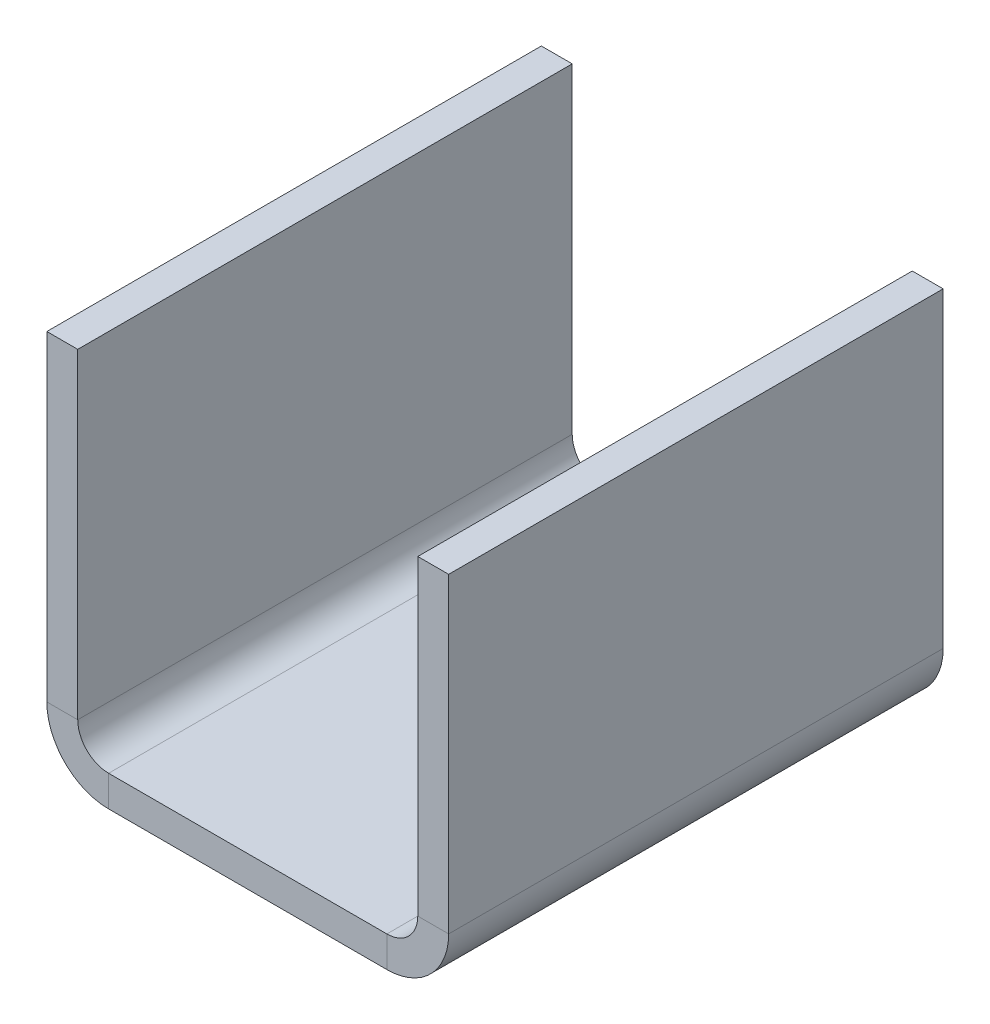
ISO-10303-21;
HEADER;
FILE_DESCRIPTION(('STEP AP214'),'2;1');
FILE_NAME('part.step','',(''),(''),'','','');
FILE_SCHEMA(('AUTOMOTIVE_DESIGN { 1 0 10303 214 1 1 1 1 }'));
ENDSEC;
DATA;
#1=APPLICATION_CONTEXT('core data for automotive mechanical design processes');
#2=APPLICATION_PROTOCOL_DEFINITION('international standard','automotive_design',2000,#1);
#3=PRODUCT_CONTEXT('',#1,'mechanical');
#4=PRODUCT('Part','Part','',(#3));
#5=PRODUCT_RELATED_PRODUCT_CATEGORY('part','',(#4));
#6=PRODUCT_DEFINITION_FORMATION('','',#4);
#7=PRODUCT_DEFINITION_CONTEXT('part definition',#1,'design');
#8=PRODUCT_DEFINITION('design','',#6,#7);
#9=PRODUCT_DEFINITION_SHAPE('','',#8);
#10=(LENGTH_UNIT() NAMED_UNIT(*) SI_UNIT(.MILLI.,.METRE.));
#11=(NAMED_UNIT(*) PLANE_ANGLE_UNIT() SI_UNIT($,.RADIAN.));
#12=(NAMED_UNIT(*) SI_UNIT($,.STERADIAN.) SOLID_ANGLE_UNIT());
#13=UNCERTAINTY_MEASURE_WITH_UNIT(LENGTH_MEASURE(1.E-05),#10,'distance_accuracy_value','');
#14=(GEOMETRIC_REPRESENTATION_CONTEXT(3) GLOBAL_UNCERTAINTY_ASSIGNED_CONTEXT((#13)) GLOBAL_UNIT_ASSIGNED_CONTEXT((#10,
#11,#12)) REPRESENTATION_CONTEXT('',''));
#15=CARTESIAN_POINT('',(0.,0.,0.));
#16=DIRECTION('',(0.,0.,1.));
#17=DIRECTION('',(1.,0.,0.));
#18=AXIS2_PLACEMENT_3D('',#15,#16,#17);
#19=CARTESIAN_POINT('',(-9.26353669583813,-2.032,0.));
#20=DIRECTION('',(0.,0.,1.));
#21=DIRECTION('',(1.,0.,0.));
#22=AXIS2_PLACEMENT_3D('',#19,#20,#21);
#23=PLANE('',#22);
#24=DIRECTION('',(0.,-1.,0.));
#25=VECTOR('',#24,1.);
#26=CARTESIAN_POINT('',(-35.4631305409845,-2.032,0.));
#27=LINE('',#26,#25);
#28=CARTESIAN_POINT('',(-35.4631305409845,0.348000065999996,0.));
#29=VERTEX_POINT('',#28);
#30=CARTESIAN_POINT('',(-35.4631305409845,-2.032,0.));
#31=VERTEX_POINT('',#30);
#32=EDGE_CURVE('E11',#29,#31,#27,.T.);
#33=ORIENTED_EDGE('',*,*,#32,.F.);
#34=DIRECTION('',(-1.,0.,0.));
#35=VECTOR('',#34,1.);
#36=CARTESIAN_POINT('',(-9.26353669583813,0.348000066,0.));
#37=LINE('',#36,#35);
#38=CARTESIAN_POINT('',(-14.0235368278381,0.348000066,0.));
#39=VERTEX_POINT('',#38);
#40=EDGE_CURVE('E98',#29,#39,#37,.F.);
#41=ORIENTED_EDGE('',*,*,#40,.T.);
#42=DIRECTION('',(0.,-1.,0.));
#43=VECTOR('',#42,1.);
#44=CARTESIAN_POINT('',(-14.0235368278381,-2.032,0.));
#45=LINE('',#44,#43);
#46=CARTESIAN_POINT('',(-14.0235368278381,-2.032,0.));
#47=VERTEX_POINT('',#46);
#48=EDGE_CURVE('E51',#39,#47,#45,.T.);
#49=ORIENTED_EDGE('',*,*,#48,.T.);
#50=DIRECTION('',(1.,0.,0.));
#51=VECTOR('',#50,1.);
#52=CARTESIAN_POINT('',(-9.26353669583813,-2.032,0.));
#53=LINE('',#52,#51);
#54=EDGE_CURVE('E100',#31,#47,#53,.T.);
#55=ORIENTED_EDGE('',*,*,#54,.F.);
#56=EDGE_LOOP('',(#33,#41,#49,#55));
#57=FACE_BOUND('',#56,.T.);
#58=ADVANCED_FACE('F41',(#57),#23,.F.);
#59=CARTESIAN_POINT('',(-14.0235368278381,2.728000132,0.));
#60=DIRECTION('',(0.,0.,1.));
#61=DIRECTION('',(1.,0.,0.));
#62=AXIS2_PLACEMENT_3D('',#59,#60,#61);
#63=PLANE('',#62);
#64=ORIENTED_EDGE('',*,*,#48,.F.);
#65=CARTESIAN_POINT('',(-14.0235368278381,2.728000132,0.));
#66=DIRECTION('',(0.,0.,-1.));
#67=DIRECTION('',(-1.,0.,0.));
#68=AXIS2_PLACEMENT_3D('',#65,#66,#67);
#69=CIRCLE('',#68,2.380000066);
#70=CARTESIAN_POINT('',(-11.6435367618381,2.728000132,0.));
#71=VERTEX_POINT('',#70);
#72=EDGE_CURVE('E139',#39,#71,#69,.F.);
#73=ORIENTED_EDGE('',*,*,#72,.T.);
#74=DIRECTION('',(1.,0.,0.));
#75=VECTOR('',#74,1.);
#76=CARTESIAN_POINT('',(-9.26353669583813,2.72800013200001,0.));
#77=LINE('',#76,#75);
#78=CARTESIAN_POINT('',(-9.26353669583813,2.72800013200001,0.));
#79=VERTEX_POINT('',#78);
#80=EDGE_CURVE('E166',#71,#79,#77,.T.);
#81=ORIENTED_EDGE('',*,*,#80,.T.);
#82=CARTESIAN_POINT('',(-14.0235368278381,2.728000132,0.));
#83=DIRECTION('',(0.,0.,-1.));
#84=DIRECTION('',(-1.,0.,0.));
#85=AXIS2_PLACEMENT_3D('',#82,#83,#84);
#86=CIRCLE('',#85,4.760000132);
#87=EDGE_CURVE('E175',#47,#79,#86,.F.);
#88=ORIENTED_EDGE('',*,*,#87,.F.);
#89=EDGE_LOOP('',(#64,#73,#81,#88));
#90=FACE_BOUND('',#89,.T.);
#91=ADVANCED_FACE('F174',(#90),#63,.F.);
#92=CARTESIAN_POINT('',(-9.26353669583813,26.7235868169829,0.));
#93=DIRECTION('',(0.,0.,1.));
#94=DIRECTION('',(0.,1.,0.));
#95=AXIS2_PLACEMENT_3D('',#92,#93,#94);
#96=PLANE('',#95);
#97=ORIENTED_EDGE('',*,*,#80,.F.);
#98=DIRECTION('',(0.,-1.,0.));
#99=VECTOR('',#98,1.);
#100=CARTESIAN_POINT('',(-11.6435367618381,26.7235868169829,0.));
#101=LINE('',#100,#99);
#102=CARTESIAN_POINT('',(-11.6435367618381,26.7235868169829,0.));
#103=VERTEX_POINT('',#102);
#104=EDGE_CURVE('E136',#71,#103,#101,.F.);
#105=ORIENTED_EDGE('',*,*,#104,.T.);
#106=DIRECTION('',(1.,0.,0.));
#107=VECTOR('',#106,1.);
#108=CARTESIAN_POINT('',(-9.26353669583813,26.7235868169829,0.));
#109=LINE('',#108,#107);
#110=CARTESIAN_POINT('',(-9.26353669583813,26.7235868169829,0.));
#111=VERTEX_POINT('',#110);
#112=EDGE_CURVE('E163',#103,#111,#109,.T.);
#113=ORIENTED_EDGE('',*,*,#112,.T.);
#114=DIRECTION('',(0.,1.,0.));
#115=VECTOR('',#114,1.);
#116=CARTESIAN_POINT('',(-9.26353669583813,26.7235868169829,0.));
#117=LINE('',#116,#115);
#118=EDGE_CURVE('E194',#79,#111,#117,.T.);
#119=ORIENTED_EDGE('',*,*,#118,.F.);
#120=EDGE_LOOP('',(#97,#105,#113,#119));
#121=FACE_BOUND('',#120,.T.);
#122=ADVANCED_FACE('F195',(#121),#96,.F.);
#123=CARTESIAN_POINT('',(-9.26353669583813,26.7235868169829,38.1));
#124=DIRECTION('',(0.,1.,0.));
#125=DIRECTION('',(0.,0.,-1.));
#126=AXIS2_PLACEMENT_3D('',#123,#124,#125);
#127=PLANE('',#126);
#128=ORIENTED_EDGE('',*,*,#112,.F.);
#129=DIRECTION('',(0.,0.,1.));
#130=VECTOR('',#129,1.);
#131=CARTESIAN_POINT('',(-11.6435367618381,26.7235868169829,38.1));
#132=LINE('',#131,#130);
#133=CARTESIAN_POINT('',(-11.6435367618381,26.7235868169829,38.1));
#134=VERTEX_POINT('',#133);
#135=EDGE_CURVE('E232',#134,#103,#132,.F.);
#136=ORIENTED_EDGE('',*,*,#135,.F.);
#137=DIRECTION('',(1.,0.,0.));
#138=VECTOR('',#137,1.);
#139=CARTESIAN_POINT('',(-9.26353669583813,26.7235868169829,38.1));
#140=LINE('',#139,#138);
#141=CARTESIAN_POINT('',(-9.26353669583813,26.7235868169829,38.1));
#142=VERTEX_POINT('',#141);
#143=EDGE_CURVE('E160',#134,#142,#140,.T.);
#144=ORIENTED_EDGE('',*,*,#143,.T.);
#145=DIRECTION('',(0.,0.,-1.));
#146=VECTOR('',#145,1.);
#147=CARTESIAN_POINT('',(-9.26353669583813,26.7235868169829,38.1));
#148=LINE('',#147,#146);
#149=EDGE_CURVE('E199',#142,#111,#148,.T.);
#150=ORIENTED_EDGE('',*,*,#149,.T.);
#151=EDGE_LOOP('',(#128,#136,#144,#150));
#152=FACE_BOUND('',#151,.T.);
#153=ADVANCED_FACE('F243',(#152),#127,.T.);
#154=CARTESIAN_POINT('',(-9.26353669583813,26.7235868169829,38.1));
#155=DIRECTION('',(0.,0.,1.));
#156=DIRECTION('',(0.,1.,0.));
#157=AXIS2_PLACEMENT_3D('',#154,#155,#156);
#158=PLANE('',#157);
#159=ORIENTED_EDGE('',*,*,#143,.F.);
#160=DIRECTION('',(0.,-1.,0.));
#161=VECTOR('',#160,1.);
#162=CARTESIAN_POINT('',(-11.6435367618381,26.7235868169829,38.1));
#163=LINE('',#162,#161);
#164=CARTESIAN_POINT('',(-11.6435367618381,2.72800013200001,38.1));
#165=VERTEX_POINT('',#164);
#166=EDGE_CURVE('E129',#165,#134,#163,.F.);
#167=ORIENTED_EDGE('',*,*,#166,.F.);
#168=DIRECTION('',(1.,0.,0.));
#169=VECTOR('',#168,1.);
#170=CARTESIAN_POINT('',(-9.26353669583813,2.72800013200001,38.1));
#171=LINE('',#170,#169);
#172=CARTESIAN_POINT('',(-9.26353669583813,2.72800013200001,38.1));
#173=VERTEX_POINT('',#172);
#174=EDGE_CURVE('E157',#165,#173,#171,.T.);
#175=ORIENTED_EDGE('',*,*,#174,.T.);
#176=DIRECTION('',(0.,1.,0.));
#177=VECTOR('',#176,1.);
#178=CARTESIAN_POINT('',(-9.26353669583813,26.7235868169829,38.1));
#179=LINE('',#178,#177);
#180=EDGE_CURVE('E205',#173,#142,#179,.T.);
#181=ORIENTED_EDGE('',*,*,#180,.T.);
#182=EDGE_LOOP('',(#159,#167,#175,#181));
#183=FACE_BOUND('',#182,.T.);
#184=ADVANCED_FACE('F293',(#183),#158,.T.);
#185=CARTESIAN_POINT('',(-14.0235368278381,2.728000132,38.1));
#186=DIRECTION('',(0.,0.,-1.));
#187=DIRECTION('',(-1.,0.,0.));
#188=AXIS2_PLACEMENT_3D('',#185,#186,#187);
#189=PLANE('',#188);
#190=ORIENTED_EDGE('',*,*,#174,.F.);
#191=CARTESIAN_POINT('',(-14.0235368278381,2.728000132,38.1));
#192=DIRECTION('',(0.,0.,-1.));
#193=DIRECTION('',(-1.,0.,0.));
#194=AXIS2_PLACEMENT_3D('',#191,#192,#193);
#195=CIRCLE('',#194,2.380000066);
#196=CARTESIAN_POINT('',(-14.0235368278381,0.348000065999999,38.1));
#197=VERTEX_POINT('',#196);
#198=EDGE_CURVE('E134',#165,#197,#195,.T.);
#199=ORIENTED_EDGE('',*,*,#198,.T.);
#200=DIRECTION('',(0.,-1.,0.));
#201=VECTOR('',#200,1.);
#202=CARTESIAN_POINT('',(-14.0235368278381,-2.032,38.1));
#203=LINE('',#202,#201);
#204=CARTESIAN_POINT('',(-14.0235368278381,-2.032,38.1));
#205=VERTEX_POINT('',#204);
#206=EDGE_CURVE('E155',#197,#205,#203,.T.);
#207=ORIENTED_EDGE('',*,*,#206,.T.);
#208=CARTESIAN_POINT('',(-14.0235368278381,2.728000132,38.1));
#209=DIRECTION('',(0.,0.,1.));
#210=DIRECTION('',(1.,0.,0.));
#211=AXIS2_PLACEMENT_3D('',#208,#209,#210);
#212=CIRCLE('',#211,4.760000132);
#213=EDGE_CURVE('E191',#173,#205,#212,.F.);
#214=ORIENTED_EDGE('',*,*,#213,.F.);
#215=EDGE_LOOP('',(#190,#199,#207,#214));
#216=FACE_BOUND('',#215,.T.);
#217=ADVANCED_FACE('F295',(#216),#189,.F.);
#218=CARTESIAN_POINT('',(-9.26353669583813,-2.032,38.1));
#219=DIRECTION('',(0.,0.,1.));
#220=DIRECTION('',(1.,0.,0.));
#221=AXIS2_PLACEMENT_3D('',#218,#219,#220);
#222=PLANE('',#221);
#223=ORIENTED_EDGE('',*,*,#206,.F.);
#224=DIRECTION('',(-1.,0.,0.));
#225=VECTOR('',#224,1.);
#226=CARTESIAN_POINT('',(-9.26353669583813,0.348000066,38.1));
#227=LINE('',#226,#225);
#228=CARTESIAN_POINT('',(-35.4631305409845,0.348000065999996,38.1));
#229=VERTEX_POINT('',#228);
#230=EDGE_CURVE('E128',#229,#197,#227,.F.);
#231=ORIENTED_EDGE('',*,*,#230,.F.);
#232=DIRECTION('',(0.,-1.,0.));
#233=VECTOR('',#232,1.);
#234=CARTESIAN_POINT('',(-35.4631305409845,-2.032,38.1));
#235=LINE('',#234,#233);
#236=CARTESIAN_POINT('',(-35.4631305409845,-2.032,38.1));
#237=VERTEX_POINT('',#236);
#238=EDGE_CURVE('E152',#229,#237,#235,.T.);
#239=ORIENTED_EDGE('',*,*,#238,.T.);
#240=DIRECTION('',(1.,0.,0.));
#241=VECTOR('',#240,1.);
#242=CARTESIAN_POINT('',(-9.26353669583813,-2.032,38.1));
#243=LINE('',#242,#241);
#244=EDGE_CURVE('E250',#237,#205,#243,.T.);
#245=ORIENTED_EDGE('',*,*,#244,.T.);
#246=EDGE_LOOP('',(#223,#231,#239,#245));
#247=FACE_BOUND('',#246,.T.);
#248=ADVANCED_FACE('F298',(#247),#222,.T.);
#249=CARTESIAN_POINT('',(-35.4631305409845,2.728000132,38.1));
#250=DIRECTION('',(0.,0.,-1.));
#251=DIRECTION('',(-1.,0.,0.));
#252=AXIS2_PLACEMENT_3D('',#249,#250,#251);
#253=PLANE('',#252);
#254=ORIENTED_EDGE('',*,*,#238,.F.);
#255=CARTESIAN_POINT('',(-35.4631305409845,2.728000132,38.1));
#256=DIRECTION('',(0.,0.,-1.));
#257=DIRECTION('',(-1.,0.,0.));
#258=AXIS2_PLACEMENT_3D('',#255,#256,#257);
#259=CIRCLE('',#258,2.380000066);
#260=CARTESIAN_POINT('',(-37.8431306069845,2.728000132,38.1));
#261=VERTEX_POINT('',#260);
#262=EDGE_CURVE('E116',#229,#261,#259,.T.);
#263=ORIENTED_EDGE('',*,*,#262,.T.);
#264=DIRECTION('',(-1.,0.,0.));
#265=VECTOR('',#264,1.);
#266=CARTESIAN_POINT('',(-40.2231306729845,2.728000132,38.1));
#267=LINE('',#266,#265);
#268=CARTESIAN_POINT('',(-40.2231306729845,2.728000132,38.1));
#269=VERTEX_POINT('',#268);
#270=EDGE_CURVE('E149',#261,#269,#267,.T.);
#271=ORIENTED_EDGE('',*,*,#270,.T.);
#272=CARTESIAN_POINT('',(-35.4631305409845,2.728000132,38.1));
#273=DIRECTION('',(0.,0.,1.));
#274=DIRECTION('',(1.,0.,0.));
#275=AXIS2_PLACEMENT_3D('',#272,#273,#274);
#276=CIRCLE('',#275,4.760000132);
#277=EDGE_CURVE('E200',#237,#269,#276,.F.);
#278=ORIENTED_EDGE('',*,*,#277,.F.);
#279=EDGE_LOOP('',(#254,#263,#271,#278));
#280=FACE_BOUND('',#279,.T.);
#281=ADVANCED_FACE('F325',(#280),#253,.F.);
#282=CARTESIAN_POINT('',(-40.2231306729845,-2.032,38.1));
#283=DIRECTION('',(0.,0.,1.));
#284=DIRECTION('',(0.,-1.,0.));
#285=AXIS2_PLACEMENT_3D('',#282,#283,#284);
#286=PLANE('',#285);
#287=ORIENTED_EDGE('',*,*,#270,.F.);
#288=DIRECTION('',(0.,1.,0.));
#289=VECTOR('',#288,1.);
#290=CARTESIAN_POINT('',(-37.8431306069845,-2.032,38.1));
#291=LINE('',#290,#289);
#292=CARTESIAN_POINT('',(-37.8431306069845,27.4465957671873,38.1));
#293=VERTEX_POINT('',#292);
#294=EDGE_CURVE('E224',#293,#261,#291,.F.);
#295=ORIENTED_EDGE('',*,*,#294,.F.);
#296=DIRECTION('',(-1.,0.,0.));
#297=VECTOR('',#296,1.);
#298=CARTESIAN_POINT('',(-40.2231306729845,27.4465957671873,38.1));
#299=LINE('',#298,#297);
#300=CARTESIAN_POINT('',(-40.2231306729845,27.4465957671873,38.1));
#301=VERTEX_POINT('',#300);
#302=EDGE_CURVE('E146',#293,#301,#299,.T.);
#303=ORIENTED_EDGE('',*,*,#302,.T.);
#304=DIRECTION('',(0.,-1.,0.));
#305=VECTOR('',#304,1.);
#306=CARTESIAN_POINT('',(-40.2231306729845,-2.032,38.1));
#307=LINE('',#306,#305);
#308=EDGE_CURVE('E256',#301,#269,#307,.T.);
#309=ORIENTED_EDGE('',*,*,#308,.T.);
#310=EDGE_LOOP('',(#287,#295,#303,#309));
#311=FACE_BOUND('',#310,.T.);
#312=ADVANCED_FACE('F274',(#311),#286,.T.);
#313=CARTESIAN_POINT('',(-40.2231306729845,27.4465957671873,38.1));
#314=DIRECTION('',(0.,-1.,0.));
#315=DIRECTION('',(0.,0.,-1.));
#316=AXIS2_PLACEMENT_3D('',#313,#314,#315);
#317=PLANE('',#316);
#318=ORIENTED_EDGE('',*,*,#302,.F.);
#319=DIRECTION('',(0.,0.,-1.));
#320=VECTOR('',#319,1.);
#321=CARTESIAN_POINT('',(-37.8431306069845,27.4465957671873,38.1));
#322=LINE('',#321,#320);
#323=CARTESIAN_POINT('',(-37.8431306069845,27.4465957671873,0.));
#324=VERTEX_POINT('',#323);
#325=EDGE_CURVE('E121',#293,#324,#322,.T.);
#326=ORIENTED_EDGE('',*,*,#325,.T.);
#327=DIRECTION('',(-1.,0.,0.));
#328=VECTOR('',#327,1.);
#329=CARTESIAN_POINT('',(-40.2231306729845,27.4465957671873,0.));
#330=LINE('',#329,#328);
#331=CARTESIAN_POINT('',(-40.2231306729845,27.4465957671873,0.));
#332=VERTEX_POINT('',#331);
#333=EDGE_CURVE('E143',#324,#332,#330,.T.);
#334=ORIENTED_EDGE('',*,*,#333,.T.);
#335=DIRECTION('',(0.,0.,-1.));
#336=VECTOR('',#335,1.);
#337=CARTESIAN_POINT('',(-40.2231306729845,27.4465957671873,38.1));
#338=LINE('',#337,#336);
#339=EDGE_CURVE('E259',#301,#332,#338,.T.);
#340=ORIENTED_EDGE('',*,*,#339,.F.);
#341=EDGE_LOOP('',(#318,#326,#334,#340));
#342=FACE_BOUND('',#341,.T.);
#343=ADVANCED_FACE('F330',(#342),#317,.F.);
#344=CARTESIAN_POINT('',(-40.2231306729845,-2.032,0.));
#345=DIRECTION('',(0.,0.,1.));
#346=DIRECTION('',(0.,-1.,0.));
#347=AXIS2_PLACEMENT_3D('',#344,#345,#346);
#348=PLANE('',#347);
#349=ORIENTED_EDGE('',*,*,#333,.F.);
#350=DIRECTION('',(0.,1.,0.));
#351=VECTOR('',#350,1.);
#352=CARTESIAN_POINT('',(-37.8431306069845,-2.032,0.));
#353=LINE('',#352,#351);
#354=CARTESIAN_POINT('',(-37.8431306069845,2.72800013199999,0.));
#355=VERTEX_POINT('',#354);
#356=EDGE_CURVE('E222',#324,#355,#353,.F.);
#357=ORIENTED_EDGE('',*,*,#356,.T.);
#358=DIRECTION('',(-1.,0.,0.));
#359=VECTOR('',#358,1.);
#360=CARTESIAN_POINT('',(-40.2231306729845,2.728000132,0.));
#361=LINE('',#360,#359);
#362=CARTESIAN_POINT('',(-40.2231306729845,2.728000132,0.));
#363=VERTEX_POINT('',#362);
#364=EDGE_CURVE('E45',#355,#363,#361,.T.);
#365=ORIENTED_EDGE('',*,*,#364,.T.);
#366=DIRECTION('',(0.,-1.,0.));
#367=VECTOR('',#366,1.);
#368=CARTESIAN_POINT('',(-40.2231306729845,-2.032,0.));
#369=LINE('',#368,#367);
#370=EDGE_CURVE('E253',#332,#363,#369,.T.);
#371=ORIENTED_EDGE('',*,*,#370,.F.);
#372=EDGE_LOOP('',(#349,#357,#365,#371));
#373=FACE_BOUND('',#372,.T.);
#374=ADVANCED_FACE('F284',(#373),#348,.F.);
#375=CARTESIAN_POINT('',(-35.4631305409845,2.728000132,0.));
#376=DIRECTION('',(0.,0.,1.));
#377=DIRECTION('',(1.,0.,0.));
#378=AXIS2_PLACEMENT_3D('',#375,#376,#377);
#379=PLANE('',#378);
#380=CARTESIAN_POINT('',(-35.4631305409845,2.728000132,0.));
#381=DIRECTION('',(0.,0.,-1.));
#382=DIRECTION('',(-1.,0.,0.));
#383=AXIS2_PLACEMENT_3D('',#380,#381,#382);
#384=CIRCLE('',#383,2.380000066);
#385=EDGE_CURVE('E113',#355,#29,#384,.F.);
#386=ORIENTED_EDGE('',*,*,#385,.T.);
#387=ORIENTED_EDGE('',*,*,#32,.T.);
#388=CARTESIAN_POINT('',(-35.4631305409845,2.728000132,0.));
#389=DIRECTION('',(0.,0.,-1.));
#390=DIRECTION('',(-1.,0.,0.));
#391=AXIS2_PLACEMENT_3D('',#388,#389,#390);
#392=CIRCLE('',#391,4.760000132);
#393=EDGE_CURVE('E217',#363,#31,#392,.F.);
#394=ORIENTED_EDGE('',*,*,#393,.F.);
#395=ORIENTED_EDGE('',*,*,#364,.F.);
#396=EDGE_LOOP('',(#386,#387,#394,#395));
#397=FACE_BOUND('',#396,.T.);
#398=ADVANCED_FACE('F43',(#397),#379,.F.);
#399=CARTESIAN_POINT('',(-40.2231306729845,-2.032,38.1));
#400=DIRECTION('',(1.,0.,0.));
#401=DIRECTION('',(0.,0.,-1.));
#402=AXIS2_PLACEMENT_3D('',#399,#400,#401);
#403=PLANE('',#402);
#404=ORIENTED_EDGE('',*,*,#370,.T.);
#405=DIRECTION('',(0.,0.,-1.));
#406=VECTOR('',#405,1.);
#407=CARTESIAN_POINT('',(-40.2231306729845,2.728000132,38.1));
#408=LINE('',#407,#406);
#409=EDGE_CURVE('E207',#363,#269,#408,.F.);
#410=ORIENTED_EDGE('',*,*,#409,.T.);
#411=ORIENTED_EDGE('',*,*,#308,.F.);
#412=ORIENTED_EDGE('',*,*,#339,.T.);
#413=EDGE_LOOP('',(#404,#410,#411,#412));
#414=FACE_BOUND('',#413,.T.);
#415=ADVANCED_FACE('F279',(#414),#403,.F.);
#416=CARTESIAN_POINT('',(-9.26353669583813,-2.032,38.1));
#417=DIRECTION('',(0.,1.,0.));
#418=DIRECTION('',(-1.,0.,0.));
#419=AXIS2_PLACEMENT_3D('',#416,#417,#418);
#420=PLANE('',#419);
#421=ORIENTED_EDGE('',*,*,#54,.T.);
#422=DIRECTION('',(0.,0.,-1.));
#423=VECTOR('',#422,1.);
#424=CARTESIAN_POINT('',(-14.0235368278381,-2.032,38.1));
#425=LINE('',#424,#423);
#426=EDGE_CURVE('E190',#47,#205,#425,.F.);
#427=ORIENTED_EDGE('',*,*,#426,.T.);
#428=ORIENTED_EDGE('',*,*,#244,.F.);
#429=DIRECTION('',(0.,0.,-1.));
#430=VECTOR('',#429,1.);
#431=CARTESIAN_POINT('',(-35.4631305409845,-2.032,38.1));
#432=LINE('',#431,#430);
#433=EDGE_CURVE('E211',#237,#31,#432,.T.);
#434=ORIENTED_EDGE('',*,*,#433,.T.);
#435=EDGE_LOOP('',(#421,#427,#428,#434));
#436=FACE_BOUND('',#435,.T.);
#437=ADVANCED_FACE('F300',(#436),#420,.F.);
#438=CARTESIAN_POINT('',(-9.26353669583813,26.7235868169829,38.1));
#439=DIRECTION('',(-1.,0.,0.));
#440=DIRECTION('',(0.,-1.,0.));
#441=AXIS2_PLACEMENT_3D('',#438,#439,#440);
#442=PLANE('',#441);
#443=ORIENTED_EDGE('',*,*,#180,.F.);
#444=DIRECTION('',(0.,0.,-1.));
#445=VECTOR('',#444,1.);
#446=CARTESIAN_POINT('',(-9.26353669583813,2.728000132,38.1));
#447=LINE('',#446,#445);
#448=EDGE_CURVE('E188',#173,#79,#447,.T.);
#449=ORIENTED_EDGE('',*,*,#448,.T.);
#450=ORIENTED_EDGE('',*,*,#118,.T.);
#451=ORIENTED_EDGE('',*,*,#149,.F.);
#452=EDGE_LOOP('',(#443,#449,#450,#451));
#453=FACE_BOUND('',#452,.T.);
#454=ADVANCED_FACE('F203',(#453),#442,.F.);
#455=CARTESIAN_POINT('',(-35.4631305409845,2.728000132,38.1));
#456=DIRECTION('',(0.,0.,-1.));
#457=DIRECTION('',(-1.,0.,0.));
#458=AXIS2_PLACEMENT_3D('',#455,#456,#457);
#459=CYLINDRICAL_SURFACE('',#458,4.760000132);
#460=ORIENTED_EDGE('',*,*,#277,.T.);
#461=ORIENTED_EDGE('',*,*,#409,.F.);
#462=ORIENTED_EDGE('',*,*,#393,.T.);
#463=ORIENTED_EDGE('',*,*,#433,.F.);
#464=EDGE_LOOP('',(#460,#461,#462,#463));
#465=FACE_BOUND('',#464,.T.);
#466=ADVANCED_FACE('F267',(#465),#459,.T.);
#467=CARTESIAN_POINT('',(-14.0235368278381,2.728000132,38.1));
#468=DIRECTION('',(0.,0.,-1.));
#469=DIRECTION('',(-1.,0.,0.));
#470=AXIS2_PLACEMENT_3D('',#467,#468,#469);
#471=CYLINDRICAL_SURFACE('',#470,4.760000132);
#472=ORIENTED_EDGE('',*,*,#213,.T.);
#473=ORIENTED_EDGE('',*,*,#426,.F.);
#474=ORIENTED_EDGE('',*,*,#87,.T.);
#475=ORIENTED_EDGE('',*,*,#448,.F.);
#476=EDGE_LOOP('',(#472,#473,#474,#475));
#477=FACE_BOUND('',#476,.T.);
#478=ADVANCED_FACE('F186',(#477),#471,.T.);
#479=CARTESIAN_POINT('',(-37.8431306069845,-2.032,38.1));
#480=DIRECTION('',(1.,0.,0.));
#481=DIRECTION('',(0.,0.,-1.));
#482=AXIS2_PLACEMENT_3D('',#479,#480,#481);
#483=PLANE('',#482);
#484=ORIENTED_EDGE('',*,*,#356,.F.);
#485=ORIENTED_EDGE('',*,*,#325,.F.);
#486=ORIENTED_EDGE('',*,*,#294,.T.);
#487=DIRECTION('',(0.,0.,-1.));
#488=VECTOR('',#487,1.);
#489=CARTESIAN_POINT('',(-37.8431306069845,2.72800013199999,38.1));
#490=LINE('',#489,#488);
#491=EDGE_CURVE('E120',#355,#261,#490,.F.);
#492=ORIENTED_EDGE('',*,*,#491,.F.);
#493=EDGE_LOOP('',(#484,#485,#486,#492));
#494=FACE_BOUND('',#493,.T.);
#495=ADVANCED_FACE('F345',(#494),#483,.T.);
#496=CARTESIAN_POINT('',(-9.26353669583813,0.348000066,38.1));
#497=DIRECTION('',(0.,1.,0.));
#498=DIRECTION('',(-1.,0.,0.));
#499=AXIS2_PLACEMENT_3D('',#496,#497,#498);
#500=PLANE('',#499);
#501=ORIENTED_EDGE('',*,*,#40,.F.);
#502=DIRECTION('',(0.,0.,1.));
#503=VECTOR('',#502,1.);
#504=CARTESIAN_POINT('',(-35.4631305409845,0.348000065999996,38.1));
#505=LINE('',#504,#503);
#506=EDGE_CURVE('E110',#229,#29,#505,.F.);
#507=ORIENTED_EDGE('',*,*,#506,.F.);
#508=ORIENTED_EDGE('',*,*,#230,.T.);
#509=DIRECTION('',(0.,0.,1.));
#510=VECTOR('',#509,1.);
#511=CARTESIAN_POINT('',(-14.0235368278381,0.348000066,38.1));
#512=LINE('',#511,#510);
#513=EDGE_CURVE('E126',#39,#197,#512,.T.);
#514=ORIENTED_EDGE('',*,*,#513,.F.);
#515=EDGE_LOOP('',(#501,#507,#508,#514));
#516=FACE_BOUND('',#515,.T.);
#517=ADVANCED_FACE('F124',(#516),#500,.T.);
#518=CARTESIAN_POINT('',(-11.6435367618381,26.7235868169829,38.1));
#519=DIRECTION('',(-1.,0.,0.));
#520=DIRECTION('',(0.,-1.,0.));
#521=AXIS2_PLACEMENT_3D('',#518,#519,#520);
#522=PLANE('',#521);
#523=ORIENTED_EDGE('',*,*,#166,.T.);
#524=ORIENTED_EDGE('',*,*,#135,.T.);
#525=ORIENTED_EDGE('',*,*,#104,.F.);
#526=DIRECTION('',(0.,0.,1.));
#527=VECTOR('',#526,1.);
#528=CARTESIAN_POINT('',(-11.6435367618381,2.72800013200001,38.1));
#529=LINE('',#528,#527);
#530=EDGE_CURVE('E218',#165,#71,#529,.F.);
#531=ORIENTED_EDGE('',*,*,#530,.F.);
#532=EDGE_LOOP('',(#523,#524,#525,#531));
#533=FACE_BOUND('',#532,.T.);
#534=ADVANCED_FACE('F238',(#533),#522,.T.);
#535=CARTESIAN_POINT('',(-35.4631305409845,2.728000132,38.1));
#536=DIRECTION('',(0.,0.,-1.));
#537=DIRECTION('',(-1.,0.,0.));
#538=AXIS2_PLACEMENT_3D('',#535,#536,#537);
#539=CYLINDRICAL_SURFACE('',#538,2.380000066);
#540=ORIENTED_EDGE('',*,*,#262,.F.);
#541=ORIENTED_EDGE('',*,*,#506,.T.);
#542=ORIENTED_EDGE('',*,*,#385,.F.);
#543=ORIENTED_EDGE('',*,*,#491,.T.);
#544=EDGE_LOOP('',(#540,#541,#542,#543));
#545=FACE_BOUND('',#544,.T.);
#546=ADVANCED_FACE('F111',(#545),#539,.F.);
#547=CARTESIAN_POINT('',(-14.0235368278381,2.728000132,38.1));
#548=DIRECTION('',(0.,0.,-1.));
#549=DIRECTION('',(-1.,0.,0.));
#550=AXIS2_PLACEMENT_3D('',#547,#548,#549);
#551=CYLINDRICAL_SURFACE('',#550,2.380000066);
#552=ORIENTED_EDGE('',*,*,#198,.F.);
#553=ORIENTED_EDGE('',*,*,#530,.T.);
#554=ORIENTED_EDGE('',*,*,#72,.F.);
#555=ORIENTED_EDGE('',*,*,#513,.T.);
#556=EDGE_LOOP('',(#552,#553,#554,#555));
#557=FACE_BOUND('',#556,.T.);
#558=ADVANCED_FACE('F335',(#557),#551,.F.);
#559=CLOSED_SHELL('',(#58,#91,#122,#153,#184,#217,#248,#281,#312,#343,#374,#398,#415,#437,#454,
#466,#478,#495,#517,#534,#546,#558));
#560=MANIFOLD_SOLID_BREP('B2',#559);
#561=ADVANCED_BREP_SHAPE_REPRESENTATION('',(#18,#560),#14);
#562=SHAPE_DEFINITION_REPRESENTATION(#9,#561);
ENDSEC;
END-ISO-10303-21;
